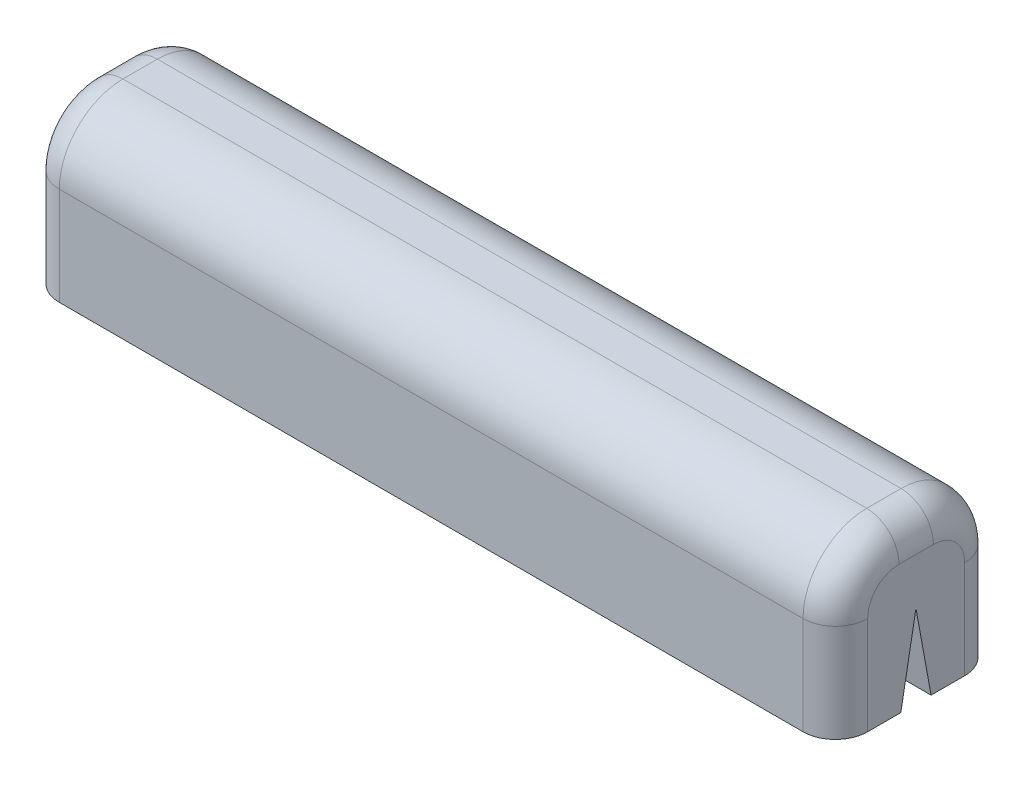
ISO-10303-21;
HEADER;
FILE_DESCRIPTION(('STEP AP214'),'2;1');
FILE_NAME('part.step','',(''),(''),'','','');
FILE_SCHEMA(('AUTOMOTIVE_DESIGN { 1 0 10303 214 1 1 1 1 }'));
ENDSEC;
DATA;
#1=APPLICATION_CONTEXT('core data for automotive mechanical design processes');
#2=APPLICATION_PROTOCOL_DEFINITION('international standard','automotive_design',2000,#1);
#3=PRODUCT_CONTEXT('',#1,'mechanical');
#4=PRODUCT('Part','Part','',(#3));
#5=PRODUCT_RELATED_PRODUCT_CATEGORY('part','',(#4));
#6=PRODUCT_DEFINITION_FORMATION('','',#4);
#7=PRODUCT_DEFINITION_CONTEXT('part definition',#1,'design');
#8=PRODUCT_DEFINITION('design','',#6,#7);
#9=PRODUCT_DEFINITION_SHAPE('','',#8);
#10=(LENGTH_UNIT() NAMED_UNIT(*) SI_UNIT(.MILLI.,.METRE.));
#11=(NAMED_UNIT(*) PLANE_ANGLE_UNIT() SI_UNIT($,.RADIAN.));
#12=(NAMED_UNIT(*) SI_UNIT($,.STERADIAN.) SOLID_ANGLE_UNIT());
#13=UNCERTAINTY_MEASURE_WITH_UNIT(LENGTH_MEASURE(1.E-05),#10,'distance_accuracy_value','');
#14=(GEOMETRIC_REPRESENTATION_CONTEXT(3) GLOBAL_UNCERTAINTY_ASSIGNED_CONTEXT((#13)) GLOBAL_UNIT_ASSIGNED_CONTEXT((#10,
#11,#12)) REPRESENTATION_CONTEXT('',''));
#15=CARTESIAN_POINT('',(0.,0.,0.));
#16=DIRECTION('',(0.,0.,1.));
#17=DIRECTION('',(1.,0.,0.));
#18=AXIS2_PLACEMENT_3D('',#15,#16,#17);
#19=CARTESIAN_POINT('',(127.,0.,15.0374537057484));
#20=DIRECTION('',(0.,1.,0.));
#21=DIRECTION('',(0.,0.,1.));
#22=AXIS2_PLACEMENT_3D('',#19,#20,#21);
#23=PLANE('',#22);
#24=DIRECTION('',(-1.,0.,0.));
#25=VECTOR('',#24,1.);
#26=CARTESIAN_POINT('',(127.,0.,15.0374537057484));
#27=LINE('',#26,#25);
#28=CARTESIAN_POINT('',(121.92,0.,15.0374537057484));
#29=VERTEX_POINT('',#28);
#30=CARTESIAN_POINT('',(5.08,0.,15.0374537057484));
#31=VERTEX_POINT('',#30);
#32=EDGE_CURVE('E310',#29,#31,#27,.T.);
#33=ORIENTED_EDGE('',*,*,#32,.T.);
#34=CARTESIAN_POINT('',(5.08,0.,9.95745370574838));
#35=DIRECTION('',(0.,1.,0.));
#36=DIRECTION('',(0.,0.,1.));
#37=AXIS2_PLACEMENT_3D('',#34,#35,#36);
#38=CIRCLE('',#37,5.08);
#39=CARTESIAN_POINT('',(0.,0.,9.95745370574838));
#40=VERTEX_POINT('',#39);
#41=EDGE_CURVE('E229',#31,#40,#38,.F.);
#42=ORIENTED_EDGE('',*,*,#41,.T.);
#43=DIRECTION('',(0.,0.,-1.));
#44=VECTOR('',#43,1.);
#45=CARTESIAN_POINT('',(0.,0.,15.0374537057484));
#46=LINE('',#45,#44);
#47=CARTESIAN_POINT('',(0.,0.,4.75045370574838));
#48=VERTEX_POINT('',#47);
#49=EDGE_CURVE('E181',#40,#48,#46,.T.);
#50=ORIENTED_EDGE('',*,*,#49,.T.);
#51=DIRECTION('',(-1.,0.,0.));
#52=VECTOR('',#51,1.);
#53=CARTESIAN_POINT('',(127.,0.,4.75045370574838));
#54=LINE('',#53,#52);
#55=CARTESIAN_POINT('',(127.,0.,4.75045370574838));
#56=VERTEX_POINT('',#55);
#57=EDGE_CURVE('E172',#56,#48,#54,.T.);
#58=ORIENTED_EDGE('',*,*,#57,.F.);
#59=DIRECTION('',(0.,0.,-1.));
#60=VECTOR('',#59,1.);
#61=CARTESIAN_POINT('',(127.,0.,15.0374537057484));
#62=LINE('',#61,#60);
#63=CARTESIAN_POINT('',(127.,0.,9.95745370574838));
#64=VERTEX_POINT('',#63);
#65=EDGE_CURVE('E156',#64,#56,#62,.T.);
#66=ORIENTED_EDGE('',*,*,#65,.F.);
#67=CARTESIAN_POINT('',(121.92,0.,9.95745370574838));
#68=DIRECTION('',(0.,1.,0.));
#69=DIRECTION('',(0.,0.,1.));
#70=AXIS2_PLACEMENT_3D('',#67,#68,#69);
#71=CIRCLE('',#70,5.08);
#72=EDGE_CURVE('E226',#64,#29,#71,.F.);
#73=ORIENTED_EDGE('',*,*,#72,.T.);
#74=EDGE_LOOP('',(#33,#42,#50,#58,#66,#73));
#75=FACE_BOUND('',#74,.T.);
#76=ADVANCED_FACE('F47',(#75),#23,.F.);
#77=CARTESIAN_POINT('',(127.,0.,4.75045370574838));
#78=DIRECTION('',(0.,0.17983243889114,0.983697257250656));
#79=DIRECTION('',(0.,-0.983697257250657,0.17983243889114));
#80=AXIS2_PLACEMENT_3D('',#77,#78,#79);
#81=PLANE('',#80);
#82=DIRECTION('',(0.,0.983697257250656,-0.17983243889114));
#83=VECTOR('',#82,1.);
#84=CARTESIAN_POINT('',(0.,0.,4.75045370574838));
#85=LINE('',#84,#83);
#86=CARTESIAN_POINT('',(0.,12.9926733737667,2.3752268528742));
#87=VERTEX_POINT('',#86);
#88=EDGE_CURVE('E345',#48,#87,#85,.T.);
#89=ORIENTED_EDGE('',*,*,#88,.T.);
#90=DIRECTION('',(-1.,0.,0.));
#91=VECTOR('',#90,1.);
#92=CARTESIAN_POINT('',(127.,12.9926733737667,2.3752268528742));
#93=LINE('',#92,#91);
#94=CARTESIAN_POINT('',(127.,12.9926733737667,2.3752268528742));
#95=VERTEX_POINT('',#94);
#96=EDGE_CURVE('E174',#95,#87,#93,.T.);
#97=ORIENTED_EDGE('',*,*,#96,.F.);
#98=DIRECTION('',(0.,0.983697257250656,-0.17983243889114));
#99=VECTOR('',#98,1.);
#100=CARTESIAN_POINT('',(127.,0.,4.75045370574838));
#101=LINE('',#100,#99);
#102=EDGE_CURVE('E159',#56,#95,#101,.T.);
#103=ORIENTED_EDGE('',*,*,#102,.F.);
#104=ORIENTED_EDGE('',*,*,#57,.T.);
#105=EDGE_LOOP('',(#89,#97,#103,#104));
#106=FACE_BOUND('',#105,.T.);
#107=ADVANCED_FACE('F171',(#106),#81,.F.);
#108=CARTESIAN_POINT('',(127.,12.9926733737667,2.3752268528742));
#109=DIRECTION('',(0.,0.179832438891141,-0.983697257250656));
#110=DIRECTION('',(0.,0.983697257250656,0.179832438891142));
#111=AXIS2_PLACEMENT_3D('',#108,#109,#110);
#112=PLANE('',#111);
#113=DIRECTION('',(0.,-0.983697257250656,-0.179832438891141));
#114=VECTOR('',#113,1.);
#115=CARTESIAN_POINT('',(0.,12.9926733737667,2.3752268528742));
#116=LINE('',#115,#114);
#117=CARTESIAN_POINT('',(0.,0.,0.));
#118=VERTEX_POINT('',#117);
#119=EDGE_CURVE('E341',#87,#118,#116,.T.);
#120=ORIENTED_EDGE('',*,*,#119,.T.);
#121=DIRECTION('',(-1.,0.,0.));
#122=VECTOR('',#121,1.);
#123=CARTESIAN_POINT('',(127.,0.,0.));
#124=LINE('',#123,#122);
#125=CARTESIAN_POINT('',(127.,0.,0.));
#126=VERTEX_POINT('',#125);
#127=EDGE_CURVE('E191',#126,#118,#124,.T.);
#128=ORIENTED_EDGE('',*,*,#127,.F.);
#129=DIRECTION('',(0.,-0.983697257250656,-0.179832438891141));
#130=VECTOR('',#129,1.);
#131=CARTESIAN_POINT('',(127.,12.9926733737667,2.3752268528742));
#132=LINE('',#131,#130);
#133=EDGE_CURVE('E177',#95,#126,#132,.T.);
#134=ORIENTED_EDGE('',*,*,#133,.F.);
#135=ORIENTED_EDGE('',*,*,#96,.T.);
#136=EDGE_LOOP('',(#120,#128,#134,#135));
#137=FACE_BOUND('',#136,.T.);
#138=ADVANCED_FACE('F353',(#137),#112,.F.);
#139=CARTESIAN_POINT('',(127.,0.,0.));
#140=DIRECTION('',(0.,1.,0.));
#141=DIRECTION('',(0.,0.,1.));
#142=AXIS2_PLACEMENT_3D('',#139,#140,#141);
#143=PLANE('',#142);
#144=DIRECTION('',(0.,0.,-1.));
#145=VECTOR('',#144,1.);
#146=CARTESIAN_POINT('',(0.,0.,0.));
#147=LINE('',#146,#145);
#148=CARTESIAN_POINT('',(0.,0.,-5.28254629425163));
#149=VERTEX_POINT('',#148);
#150=EDGE_CURVE('E167',#118,#149,#147,.T.);
#151=ORIENTED_EDGE('',*,*,#150,.T.);
#152=CARTESIAN_POINT('',(5.08,0.,-5.28254629425163));
#153=DIRECTION('',(0.,1.,0.));
#154=DIRECTION('',(0.,0.,1.));
#155=AXIS2_PLACEMENT_3D('',#152,#153,#154);
#156=CIRCLE('',#155,5.08);
#157=CARTESIAN_POINT('',(5.08,0.,-10.3625462942516));
#158=VERTEX_POINT('',#157);
#159=EDGE_CURVE('E235',#149,#158,#156,.F.);
#160=ORIENTED_EDGE('',*,*,#159,.T.);
#161=DIRECTION('',(-1.,0.,0.));
#162=VECTOR('',#161,1.);
#163=CARTESIAN_POINT('',(127.,0.,-10.3625462942516));
#164=LINE('',#163,#162);
#165=CARTESIAN_POINT('',(121.92,0.,-10.3625462942516));
#166=VERTEX_POINT('',#165);
#167=EDGE_CURVE('E317',#166,#158,#164,.T.);
#168=ORIENTED_EDGE('',*,*,#167,.F.);
#169=CARTESIAN_POINT('',(121.92,0.,-5.28254629425163));
#170=DIRECTION('',(0.,1.,0.));
#171=DIRECTION('',(0.,0.,1.));
#172=AXIS2_PLACEMENT_3D('',#169,#170,#171);
#173=CIRCLE('',#172,5.08);
#174=CARTESIAN_POINT('',(127.,0.,-5.28254629425163));
#175=VERTEX_POINT('',#174);
#176=EDGE_CURVE('E232',#166,#175,#173,.F.);
#177=ORIENTED_EDGE('',*,*,#176,.T.);
#178=DIRECTION('',(0.,0.,-1.));
#179=VECTOR('',#178,1.);
#180=CARTESIAN_POINT('',(127.,0.,0.));
#181=LINE('',#180,#179);
#182=EDGE_CURVE('E318',#126,#175,#181,.T.);
#183=ORIENTED_EDGE('',*,*,#182,.F.);
#184=ORIENTED_EDGE('',*,*,#127,.T.);
#185=EDGE_LOOP('',(#151,#160,#168,#177,#183,#184));
#186=FACE_BOUND('',#185,.T.);
#187=ADVANCED_FACE('F335',(#186),#143,.F.);
#188=CARTESIAN_POINT('',(127.,25.4,-10.3625462942516));
#189=DIRECTION('',(0.,0.,-1.));
#190=DIRECTION('',(-1.,0.,0.));
#191=AXIS2_PLACEMENT_3D('',#188,#189,#190);
#192=PLANE('',#191);
#193=ORIENTED_EDGE('',*,*,#167,.T.);
#194=DIRECTION('',(0.,-1.,0.));
#195=VECTOR('',#194,1.);
#196=CARTESIAN_POINT('',(5.08,25.4,-10.3625462942516));
#197=LINE('',#196,#195);
#198=CARTESIAN_POINT('',(5.08,15.4,-10.3625462942516));
#199=VERTEX_POINT('',#198);
#200=EDGE_CURVE('E242',#158,#199,#197,.F.);
#201=ORIENTED_EDGE('',*,*,#200,.T.);
#202=DIRECTION('',(-1.,0.,0.));
#203=VECTOR('',#202,1.);
#204=CARTESIAN_POINT('',(127.,15.4,-10.3625462942516));
#205=LINE('',#204,#203);
#206=CARTESIAN_POINT('',(121.92,15.4,-10.3625462942516));
#207=VERTEX_POINT('',#206);
#208=EDGE_CURVE('E200',#199,#207,#205,.F.);
#209=ORIENTED_EDGE('',*,*,#208,.T.);
#210=DIRECTION('',(0.,-1.,0.));
#211=VECTOR('',#210,1.);
#212=CARTESIAN_POINT('',(121.92,0.,-10.3625462942516));
#213=LINE('',#212,#211);
#214=EDGE_CURVE('E238',#207,#166,#213,.T.);
#215=ORIENTED_EDGE('',*,*,#214,.T.);
#216=EDGE_LOOP('',(#193,#201,#209,#215));
#217=FACE_BOUND('',#216,.T.);
#218=ADVANCED_FACE('F361',(#217),#192,.T.);
#219=CARTESIAN_POINT('',(127.,25.4,15.0374537057484));
#220=DIRECTION('',(0.,1.,0.));
#221=DIRECTION('',(0.,0.,1.));
#222=AXIS2_PLACEMENT_3D('',#219,#220,#221);
#223=PLANE('',#222);
#224=DIRECTION('',(-1.,0.,0.));
#225=VECTOR('',#224,1.);
#226=CARTESIAN_POINT('',(127.,25.4,5.03745370574837));
#227=LINE('',#226,#225);
#228=CARTESIAN_POINT('',(5.08,25.4,5.03745370574837));
#229=VERTEX_POINT('',#228);
#230=CARTESIAN_POINT('',(121.92,25.4,5.03745370574837));
#231=VERTEX_POINT('',#230);
#232=EDGE_CURVE('E197',#229,#231,#227,.F.);
#233=ORIENTED_EDGE('',*,*,#232,.T.);
#234=DIRECTION('',(0.,0.,-1.));
#235=VECTOR('',#234,1.);
#236=CARTESIAN_POINT('',(121.92,25.4,-0.362546294251629));
#237=LINE('',#236,#235);
#238=CARTESIAN_POINT('',(121.92,25.4,-0.362546294251628));
#239=VERTEX_POINT('',#238);
#240=EDGE_CURVE('E11',#231,#239,#237,.T.);
#241=ORIENTED_EDGE('',*,*,#240,.T.);
#242=DIRECTION('',(-1.,0.,0.));
#243=VECTOR('',#242,1.);
#244=CARTESIAN_POINT('',(127.,25.4,-0.362546294251628));
#245=LINE('',#244,#243);
#246=CARTESIAN_POINT('',(5.08,25.4,-0.362546294251628));
#247=VERTEX_POINT('',#246);
#248=EDGE_CURVE('E189',#239,#247,#245,.T.);
#249=ORIENTED_EDGE('',*,*,#248,.T.);
#250=DIRECTION('',(0.,0.,-1.));
#251=VECTOR('',#250,1.);
#252=CARTESIAN_POINT('',(5.08,25.4,15.0374537057484));
#253=LINE('',#252,#251);
#254=EDGE_CURVE('E57',#247,#229,#253,.F.);
#255=ORIENTED_EDGE('',*,*,#254,.T.);
#256=EDGE_LOOP('',(#233,#241,#249,#255));
#257=FACE_BOUND('',#256,.T.);
#258=ADVANCED_FACE('F467',(#257),#223,.T.);
#259=CARTESIAN_POINT('',(127.,0.,15.0374537057484));
#260=DIRECTION('',(0.,0.,1.));
#261=DIRECTION('',(0.,-1.,0.));
#262=AXIS2_PLACEMENT_3D('',#259,#260,#261);
#263=PLANE('',#262);
#264=DIRECTION('',(-1.,0.,0.));
#265=VECTOR('',#264,1.);
#266=CARTESIAN_POINT('',(127.,15.4,15.0374537057484));
#267=LINE('',#266,#265);
#268=CARTESIAN_POINT('',(121.92,15.4,15.0374537057484));
#269=VERTEX_POINT('',#268);
#270=CARTESIAN_POINT('',(5.08,15.4,15.0374537057484));
#271=VERTEX_POINT('',#270);
#272=EDGE_CURVE('E184',#269,#271,#267,.T.);
#273=ORIENTED_EDGE('',*,*,#272,.T.);
#274=DIRECTION('',(0.,1.,0.));
#275=VECTOR('',#274,1.);
#276=CARTESIAN_POINT('',(5.08,0.,15.0374537057484));
#277=LINE('',#276,#275);
#278=EDGE_CURVE('E223',#271,#31,#277,.F.);
#279=ORIENTED_EDGE('',*,*,#278,.T.);
#280=ORIENTED_EDGE('',*,*,#32,.F.);
#281=DIRECTION('',(0.,1.,0.));
#282=VECTOR('',#281,1.);
#283=CARTESIAN_POINT('',(121.92,15.4,15.0374537057484));
#284=LINE('',#283,#282);
#285=EDGE_CURVE('E220',#29,#269,#284,.T.);
#286=ORIENTED_EDGE('',*,*,#285,.T.);
#287=EDGE_LOOP('',(#273,#279,#280,#286));
#288=FACE_BOUND('',#287,.T.);
#289=ADVANCED_FACE('F313',(#288),#263,.T.);
#290=CARTESIAN_POINT('',(127.,0.,0.));
#291=DIRECTION('',(-1.,0.,0.));
#292=DIRECTION('',(0.,0.,1.));
#293=AXIS2_PLACEMENT_3D('',#290,#291,#292);
#294=PLANE('',#293);
#295=CARTESIAN_POINT('',(127.,15.4,5.03745370574837));
#296=DIRECTION('',(-1.,0.,0.));
#297=DIRECTION('',(0.,0.,1.));
#298=AXIS2_PLACEMENT_3D('',#295,#296,#297);
#299=CIRCLE('',#298,4.92);
#300=CARTESIAN_POINT('',(127.,20.32,5.03745370574837));
#301=VERTEX_POINT('',#300);
#302=CARTESIAN_POINT('',(127.,15.4,9.95745370574837));
#303=VERTEX_POINT('',#302);
#304=EDGE_CURVE('E254',#301,#303,#299,.F.);
#305=ORIENTED_EDGE('',*,*,#304,.T.);
#306=DIRECTION('',(0.,1.,0.));
#307=VECTOR('',#306,1.);
#308=CARTESIAN_POINT('',(127.,0.,9.95745370574838));
#309=LINE('',#308,#307);
#310=EDGE_CURVE('E162',#303,#64,#309,.F.);
#311=ORIENTED_EDGE('',*,*,#310,.T.);
#312=ORIENTED_EDGE('',*,*,#65,.T.);
#313=ORIENTED_EDGE('',*,*,#102,.T.);
#314=ORIENTED_EDGE('',*,*,#133,.T.);
#315=ORIENTED_EDGE('',*,*,#182,.T.);
#316=DIRECTION('',(0.,-1.,0.));
#317=VECTOR('',#316,1.);
#318=CARTESIAN_POINT('',(127.,15.4,-5.28254629425163));
#319=LINE('',#318,#317);
#320=CARTESIAN_POINT('',(127.,15.4,-5.28254629425163));
#321=VERTEX_POINT('',#320);
#322=EDGE_CURVE('E251',#175,#321,#319,.F.);
#323=ORIENTED_EDGE('',*,*,#322,.T.);
#324=CARTESIAN_POINT('',(127.,15.4,-0.362546294251627));
#325=DIRECTION('',(-1.,0.,0.));
#326=DIRECTION('',(0.,0.,1.));
#327=AXIS2_PLACEMENT_3D('',#324,#325,#326);
#328=CIRCLE('',#327,4.92);
#329=CARTESIAN_POINT('',(127.,20.32,-0.362546294251628));
#330=VERTEX_POINT('',#329);
#331=EDGE_CURVE('E245',#321,#330,#328,.F.);
#332=ORIENTED_EDGE('',*,*,#331,.T.);
#333=DIRECTION('',(0.,0.,-1.));
#334=VECTOR('',#333,1.);
#335=CARTESIAN_POINT('',(127.,20.32,5.03745370574837));
#336=LINE('',#335,#334);
#337=EDGE_CURVE('E248',#330,#301,#336,.F.);
#338=ORIENTED_EDGE('',*,*,#337,.T.);
#339=EDGE_LOOP('',(#305,#311,#312,#313,#314,#315,#323,#332,#338));
#340=FACE_BOUND('',#339,.T.);
#341=ADVANCED_FACE('F158',(#340),#294,.F.);
#342=CARTESIAN_POINT('',(0.,0.,0.));
#343=DIRECTION('',(-1.,0.,0.));
#344=DIRECTION('',(0.,0.,1.));
#345=AXIS2_PLACEMENT_3D('',#342,#343,#344);
#346=PLANE('',#345);
#347=ORIENTED_EDGE('',*,*,#49,.F.);
#348=DIRECTION('',(0.,1.,0.));
#349=VECTOR('',#348,1.);
#350=CARTESIAN_POINT('',(0.,0.,9.95745370574838));
#351=LINE('',#350,#349);
#352=CARTESIAN_POINT('',(0.,15.4,9.95745370574837));
#353=VERTEX_POINT('',#352);
#354=EDGE_CURVE('E216',#40,#353,#351,.T.);
#355=ORIENTED_EDGE('',*,*,#354,.T.);
#356=CARTESIAN_POINT('',(0.,15.4,5.03745370574837));
#357=DIRECTION('',(-1.,0.,0.));
#358=DIRECTION('',(0.,0.,1.));
#359=AXIS2_PLACEMENT_3D('',#356,#357,#358);
#360=CIRCLE('',#359,4.92);
#361=CARTESIAN_POINT('',(0.,20.32,5.03745370574837));
#362=VERTEX_POINT('',#361);
#363=EDGE_CURVE('E210',#353,#362,#360,.T.);
#364=ORIENTED_EDGE('',*,*,#363,.T.);
#365=DIRECTION('',(0.,0.,-1.));
#366=VECTOR('',#365,1.);
#367=CARTESIAN_POINT('',(0.,20.32,0.));
#368=LINE('',#367,#366);
#369=CARTESIAN_POINT('',(0.,20.32,-0.362546294251627));
#370=VERTEX_POINT('',#369);
#371=EDGE_CURVE('E204',#362,#370,#368,.T.);
#372=ORIENTED_EDGE('',*,*,#371,.T.);
#373=CARTESIAN_POINT('',(0.,15.4,-0.362546294251627));
#374=DIRECTION('',(-1.,0.,0.));
#375=DIRECTION('',(0.,0.,1.));
#376=AXIS2_PLACEMENT_3D('',#373,#374,#375);
#377=CIRCLE('',#376,4.92);
#378=CARTESIAN_POINT('',(0.,15.4,-5.28254629425163));
#379=VERTEX_POINT('',#378);
#380=EDGE_CURVE('E207',#370,#379,#377,.T.);
#381=ORIENTED_EDGE('',*,*,#380,.T.);
#382=DIRECTION('',(0.,-1.,0.));
#383=VECTOR('',#382,1.);
#384=CARTESIAN_POINT('',(0.,0.,-5.28254629425163));
#385=LINE('',#384,#383);
#386=EDGE_CURVE('E213',#379,#149,#385,.T.);
#387=ORIENTED_EDGE('',*,*,#386,.T.);
#388=ORIENTED_EDGE('',*,*,#150,.F.);
#389=ORIENTED_EDGE('',*,*,#119,.F.);
#390=ORIENTED_EDGE('',*,*,#88,.F.);
#391=EDGE_LOOP('',(#347,#355,#364,#372,#381,#387,#388,#389,#390));
#392=FACE_BOUND('',#391,.T.);
#393=ADVANCED_FACE('F340',(#392),#346,.T.);
#394=CARTESIAN_POINT('',(127.,15.4,5.03745370574837));
#395=DIRECTION('',(-1.,0.,0.));
#396=DIRECTION('',(0.,0.,1.));
#397=AXIS2_PLACEMENT_3D('',#394,#395,#396);
#398=CYLINDRICAL_SURFACE('',#397,10.);
#399=ORIENTED_EDGE('',*,*,#232,.F.);
#400=CARTESIAN_POINT('',(5.08,15.4,5.03745370574837));
#401=DIRECTION('',(-1.,0.,0.));
#402=DIRECTION('',(0.,0.,1.));
#403=AXIS2_PLACEMENT_3D('',#400,#401,#402);
#404=CIRCLE('',#403,10.);
#405=EDGE_CURVE('E262',#229,#271,#404,.F.);
#406=ORIENTED_EDGE('',*,*,#405,.T.);
#407=ORIENTED_EDGE('',*,*,#272,.F.);
#408=CARTESIAN_POINT('',(121.92,15.4,5.03745370574837));
#409=DIRECTION('',(-1.,0.,0.));
#410=DIRECTION('',(0.,0.,1.));
#411=AXIS2_PLACEMENT_3D('',#408,#409,#410);
#412=CIRCLE('',#411,10.);
#413=EDGE_CURVE('E259',#269,#231,#412,.T.);
#414=ORIENTED_EDGE('',*,*,#413,.T.);
#415=EDGE_LOOP('',(#399,#406,#407,#414));
#416=FACE_BOUND('',#415,.T.);
#417=ADVANCED_FACE('F368',(#416),#398,.T.);
#418=CARTESIAN_POINT('',(127.,15.4,-0.362546294251627));
#419=DIRECTION('',(-1.,0.,0.));
#420=DIRECTION('',(0.,0.,1.));
#421=AXIS2_PLACEMENT_3D('',#418,#419,#420);
#422=CYLINDRICAL_SURFACE('',#421,10.);
#423=ORIENTED_EDGE('',*,*,#208,.F.);
#424=CARTESIAN_POINT('',(5.08,15.4,-0.362546294251627));
#425=DIRECTION('',(-1.,0.,0.));
#426=DIRECTION('',(0.,0.,1.));
#427=AXIS2_PLACEMENT_3D('',#424,#425,#426);
#428=CIRCLE('',#427,10.);
#429=EDGE_CURVE('E65',#199,#247,#428,.F.);
#430=ORIENTED_EDGE('',*,*,#429,.T.);
#431=ORIENTED_EDGE('',*,*,#248,.F.);
#432=CARTESIAN_POINT('',(121.92,15.4,-0.362546294251627));
#433=DIRECTION('',(-1.,0.,0.));
#434=DIRECTION('',(0.,0.,1.));
#435=AXIS2_PLACEMENT_3D('',#432,#433,#434);
#436=CIRCLE('',#435,10.);
#437=EDGE_CURVE('E265',#239,#207,#436,.T.);
#438=ORIENTED_EDGE('',*,*,#437,.T.);
#439=EDGE_LOOP('',(#423,#430,#431,#438));
#440=FACE_BOUND('',#439,.T.);
#441=ADVANCED_FACE('F371',(#440),#422,.T.);
#442=CARTESIAN_POINT('',(5.08,0.,-5.28254629425163));
#443=DIRECTION('',(0.,-1.,0.));
#444=DIRECTION('',(0.,0.,-1.));
#445=AXIS2_PLACEMENT_3D('',#442,#443,#444);
#446=CYLINDRICAL_SURFACE('',#445,5.08);
#447=ORIENTED_EDGE('',*,*,#159,.F.);
#448=ORIENTED_EDGE('',*,*,#386,.F.);
#449=CARTESIAN_POINT('',(5.08,15.4,-5.28254629425163));
#450=DIRECTION('',(0.,1.,0.));
#451=DIRECTION('',(0.,0.,1.));
#452=AXIS2_PLACEMENT_3D('',#449,#450,#451);
#453=CIRCLE('',#452,5.08);
#454=EDGE_CURVE('E283',#199,#379,#453,.T.);
#455=ORIENTED_EDGE('',*,*,#454,.F.);
#456=ORIENTED_EDGE('',*,*,#200,.F.);
#457=EDGE_LOOP('',(#447,#448,#455,#456));
#458=FACE_BOUND('',#457,.T.);
#459=ADVANCED_FACE('F375',(#458),#446,.T.);
#460=CARTESIAN_POINT('',(5.08,15.4,-0.362546294251627));
#461=DIRECTION('',(-1.,0.,0.));
#462=DIRECTION('',(0.,0.,1.));
#463=AXIS2_PLACEMENT_3D('',#460,#461,#462);
#464=DEGENERATE_TOROIDAL_SURFACE('',#463,4.92,5.08,.T.);
#465=ORIENTED_EDGE('',*,*,#454,.T.);
#466=ORIENTED_EDGE('',*,*,#380,.F.);
#467=CARTESIAN_POINT('',(5.08,20.32,-0.362546294251627));
#468=DIRECTION('',(0.,0.,1.));
#469=DIRECTION('',(0.,-1.,0.));
#470=AXIS2_PLACEMENT_3D('',#467,#468,#469);
#471=CIRCLE('',#470,5.08);
#472=EDGE_CURVE('E279',#247,#370,#471,.T.);
#473=ORIENTED_EDGE('',*,*,#472,.F.);
#474=ORIENTED_EDGE('',*,*,#429,.F.);
#475=EDGE_LOOP('',(#465,#466,#473,#474));
#476=FACE_BOUND('',#475,.T.);
#477=ADVANCED_FACE('F387',(#476),#464,.T.);
#478=CARTESIAN_POINT('',(5.08,20.32,0.));
#479=DIRECTION('',(0.,0.,-1.));
#480=DIRECTION('',(0.,1.,0.));
#481=AXIS2_PLACEMENT_3D('',#478,#479,#480);
#482=CYLINDRICAL_SURFACE('',#481,5.08);
#483=ORIENTED_EDGE('',*,*,#472,.T.);
#484=ORIENTED_EDGE('',*,*,#371,.F.);
#485=CARTESIAN_POINT('',(5.08,20.32,5.03745370574837));
#486=DIRECTION('',(0.,0.,1.));
#487=DIRECTION('',(0.,-1.,0.));
#488=AXIS2_PLACEMENT_3D('',#485,#486,#487);
#489=CIRCLE('',#488,5.08);
#490=EDGE_CURVE('E275',#229,#362,#489,.T.);
#491=ORIENTED_EDGE('',*,*,#490,.F.);
#492=ORIENTED_EDGE('',*,*,#254,.F.);
#493=EDGE_LOOP('',(#483,#484,#491,#492));
#494=FACE_BOUND('',#493,.T.);
#495=ADVANCED_FACE('F383',(#494),#482,.T.);
#496=CARTESIAN_POINT('',(5.08,15.4,5.03745370574837));
#497=DIRECTION('',(-1.,0.,0.));
#498=DIRECTION('',(0.,0.,1.));
#499=AXIS2_PLACEMENT_3D('',#496,#497,#498);
#500=DEGENERATE_TOROIDAL_SURFACE('',#499,4.92,5.08,.T.);
#501=ORIENTED_EDGE('',*,*,#490,.T.);
#502=ORIENTED_EDGE('',*,*,#363,.F.);
#503=CARTESIAN_POINT('',(5.08,15.4,9.95745370574837));
#504=DIRECTION('',(0.,-1.,0.));
#505=DIRECTION('',(0.,0.,-1.));
#506=AXIS2_PLACEMENT_3D('',#503,#504,#505);
#507=CIRCLE('',#506,5.08);
#508=EDGE_CURVE('E272',#271,#353,#507,.T.);
#509=ORIENTED_EDGE('',*,*,#508,.F.);
#510=ORIENTED_EDGE('',*,*,#405,.F.);
#511=EDGE_LOOP('',(#501,#502,#509,#510));
#512=FACE_BOUND('',#511,.T.);
#513=ADVANCED_FACE('F379',(#512),#500,.T.);
#514=CARTESIAN_POINT('',(5.08,0.,9.95745370574838));
#515=DIRECTION('',(0.,1.,0.));
#516=DIRECTION('',(0.,0.,1.));
#517=AXIS2_PLACEMENT_3D('',#514,#515,#516);
#518=CYLINDRICAL_SURFACE('',#517,5.08);
#519=ORIENTED_EDGE('',*,*,#41,.F.);
#520=ORIENTED_EDGE('',*,*,#278,.F.);
#521=ORIENTED_EDGE('',*,*,#508,.T.);
#522=ORIENTED_EDGE('',*,*,#354,.F.);
#523=EDGE_LOOP('',(#519,#520,#521,#522));
#524=FACE_BOUND('',#523,.T.);
#525=ADVANCED_FACE('F376',(#524),#518,.T.);
#526=CARTESIAN_POINT('',(121.92,0.,9.95745370574838));
#527=DIRECTION('',(0.,-1.,0.));
#528=DIRECTION('',(0.,0.,-1.));
#529=AXIS2_PLACEMENT_3D('',#526,#527,#528);
#530=CYLINDRICAL_SURFACE('',#529,5.08);
#531=ORIENTED_EDGE('',*,*,#72,.F.);
#532=ORIENTED_EDGE('',*,*,#310,.F.);
#533=CARTESIAN_POINT('',(121.92,15.4,9.95745370574837));
#534=DIRECTION('',(0.,1.,0.));
#535=DIRECTION('',(0.,0.,1.));
#536=AXIS2_PLACEMENT_3D('',#533,#534,#535);
#537=CIRCLE('',#536,5.08);
#538=EDGE_CURVE('E51',#269,#303,#537,.T.);
#539=ORIENTED_EDGE('',*,*,#538,.F.);
#540=ORIENTED_EDGE('',*,*,#285,.F.);
#541=EDGE_LOOP('',(#531,#532,#539,#540));
#542=FACE_BOUND('',#541,.T.);
#543=ADVANCED_FACE('F49',(#542),#530,.T.);
#544=CARTESIAN_POINT('',(121.92,15.4,5.03745370574837));
#545=DIRECTION('',(-1.,0.,0.));
#546=DIRECTION('',(0.,0.,1.));
#547=AXIS2_PLACEMENT_3D('',#544,#545,#546);
#548=DEGENERATE_TOROIDAL_SURFACE('',#547,4.92,5.08,.T.);
#549=ORIENTED_EDGE('',*,*,#538,.T.);
#550=ORIENTED_EDGE('',*,*,#304,.F.);
#551=CARTESIAN_POINT('',(121.92,20.32,5.03745370574837));
#552=DIRECTION('',(0.,0.,-1.));
#553=DIRECTION('',(0.,1.,0.));
#554=AXIS2_PLACEMENT_3D('',#551,#552,#553);
#555=CIRCLE('',#554,5.08);
#556=EDGE_CURVE('E294',#231,#301,#555,.T.);
#557=ORIENTED_EDGE('',*,*,#556,.F.);
#558=ORIENTED_EDGE('',*,*,#413,.F.);
#559=EDGE_LOOP('',(#549,#550,#557,#558));
#560=FACE_BOUND('',#559,.T.);
#561=ADVANCED_FACE('F306',(#560),#548,.T.);
#562=CARTESIAN_POINT('',(121.92,20.32,15.0374537057484));
#563=DIRECTION('',(0.,0.,1.));
#564=DIRECTION('',(0.,-1.,0.));
#565=AXIS2_PLACEMENT_3D('',#562,#563,#564);
#566=CYLINDRICAL_SURFACE('',#565,5.08);
#567=ORIENTED_EDGE('',*,*,#556,.T.);
#568=ORIENTED_EDGE('',*,*,#337,.F.);
#569=CARTESIAN_POINT('',(121.92,20.32,-0.362546294251628));
#570=DIRECTION('',(0.,0.,-1.));
#571=DIRECTION('',(0.,1.,0.));
#572=AXIS2_PLACEMENT_3D('',#569,#570,#571);
#573=CIRCLE('',#572,5.08);
#574=EDGE_CURVE('E291',#239,#330,#573,.T.);
#575=ORIENTED_EDGE('',*,*,#574,.F.);
#576=ORIENTED_EDGE('',*,*,#240,.F.);
#577=EDGE_LOOP('',(#567,#568,#575,#576));
#578=FACE_BOUND('',#577,.T.);
#579=ADVANCED_FACE('F402',(#578),#566,.T.);
#580=CARTESIAN_POINT('',(121.92,15.4,-0.362546294251627));
#581=DIRECTION('',(-1.,0.,0.));
#582=DIRECTION('',(0.,0.,1.));
#583=AXIS2_PLACEMENT_3D('',#580,#581,#582);
#584=DEGENERATE_TOROIDAL_SURFACE('',#583,4.92,5.08,.T.);
#585=ORIENTED_EDGE('',*,*,#574,.T.);
#586=ORIENTED_EDGE('',*,*,#331,.F.);
#587=CARTESIAN_POINT('',(121.92,15.4,-5.28254629425163));
#588=DIRECTION('',(0.,-1.,0.));
#589=DIRECTION('',(0.,0.,-1.));
#590=AXIS2_PLACEMENT_3D('',#587,#588,#589);
#591=CIRCLE('',#590,5.08);
#592=EDGE_CURVE('E287',#207,#321,#591,.T.);
#593=ORIENTED_EDGE('',*,*,#592,.F.);
#594=ORIENTED_EDGE('',*,*,#437,.F.);
#595=EDGE_LOOP('',(#585,#586,#593,#594));
#596=FACE_BOUND('',#595,.T.);
#597=ADVANCED_FACE('F398',(#596),#584,.T.);
#598=CARTESIAN_POINT('',(121.92,25.4,-5.28254629425163));
#599=DIRECTION('',(0.,1.,0.));
#600=DIRECTION('',(0.,0.,1.));
#601=AXIS2_PLACEMENT_3D('',#598,#599,#600);
#602=CYLINDRICAL_SURFACE('',#601,5.08);
#603=ORIENTED_EDGE('',*,*,#592,.T.);
#604=ORIENTED_EDGE('',*,*,#322,.F.);
#605=ORIENTED_EDGE('',*,*,#176,.F.);
#606=ORIENTED_EDGE('',*,*,#214,.F.);
#607=EDGE_LOOP('',(#603,#604,#605,#606));
#608=FACE_BOUND('',#607,.T.);
#609=ADVANCED_FACE('F395',(#608),#602,.T.);
#610=CLOSED_SHELL('',(#76,#107,#138,#187,#218,#258,#289,#341,#393,#417,#441,#459,#477,#495,#513,
#525,#543,#561,#579,#597,#609));
#611=MANIFOLD_SOLID_BREP('B2',#610);
#612=ADVANCED_BREP_SHAPE_REPRESENTATION('',(#18,#611),#14);
#613=SHAPE_DEFINITION_REPRESENTATION(#9,#612);
ENDSEC;
END-ISO-10303-21;
